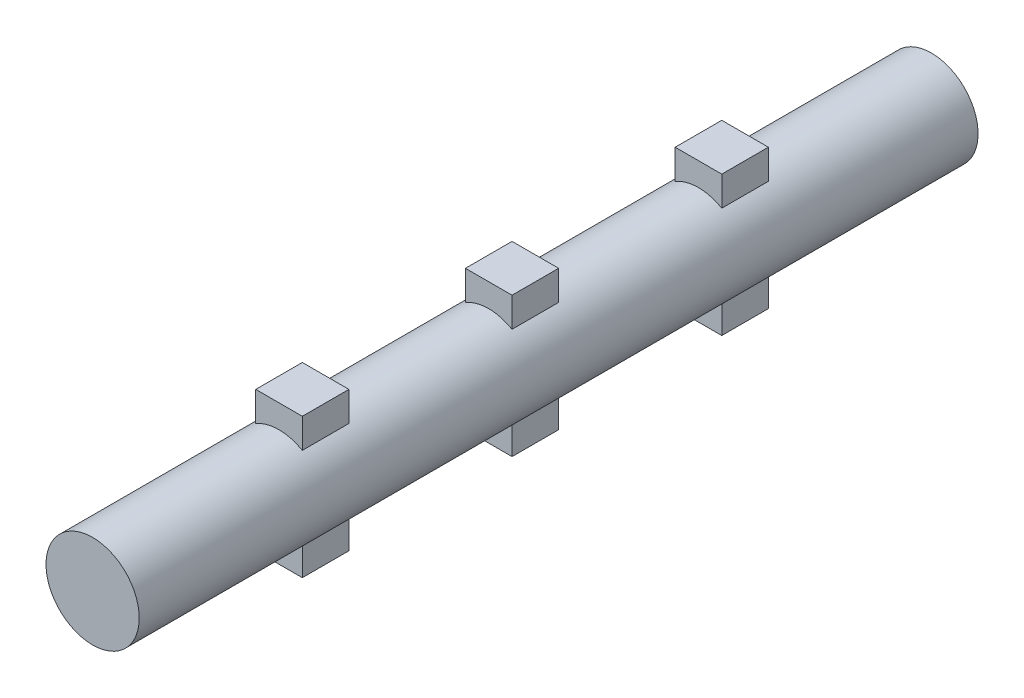
ISO-10303-21;
HEADER;
FILE_DESCRIPTION(('STEP AP214'),'2;1');
FILE_NAME('part.step','',(''),(''),'','','');
FILE_SCHEMA(('AUTOMOTIVE_DESIGN { 1 0 10303 214 1 1 1 1 }'));
ENDSEC;
DATA;
#1=APPLICATION_CONTEXT('core data for automotive mechanical design processes');
#2=APPLICATION_PROTOCOL_DEFINITION('international standard','automotive_design',2000,#1);
#3=PRODUCT_CONTEXT('',#1,'mechanical');
#4=PRODUCT('Part','Part','',(#3));
#5=PRODUCT_RELATED_PRODUCT_CATEGORY('part','',(#4));
#6=PRODUCT_DEFINITION_FORMATION('','',#4);
#7=PRODUCT_DEFINITION_CONTEXT('part definition',#1,'design');
#8=PRODUCT_DEFINITION('design','',#6,#7);
#9=PRODUCT_DEFINITION_SHAPE('','',#8);
#10=(LENGTH_UNIT() NAMED_UNIT(*) SI_UNIT(.MILLI.,.METRE.));
#11=(NAMED_UNIT(*) PLANE_ANGLE_UNIT() SI_UNIT($,.RADIAN.));
#12=(NAMED_UNIT(*) SI_UNIT($,.STERADIAN.) SOLID_ANGLE_UNIT());
#13=UNCERTAINTY_MEASURE_WITH_UNIT(LENGTH_MEASURE(1.E-05),#10,'distance_accuracy_value','');
#14=(GEOMETRIC_REPRESENTATION_CONTEXT(3) GLOBAL_UNCERTAINTY_ASSIGNED_CONTEXT((#13)) GLOBAL_UNIT_ASSIGNED_CONTEXT((#10,
#11,#12)) REPRESENTATION_CONTEXT('',''));
#15=CARTESIAN_POINT('',(0.,0.,0.));
#16=DIRECTION('',(0.,0.,1.));
#17=DIRECTION('',(1.,0.,0.));
#18=AXIS2_PLACEMENT_3D('',#15,#16,#17);
#19=CARTESIAN_POINT('',(0.,0.,25.));
#20=DIRECTION('',(0.,0.,1.));
#21=DIRECTION('',(1.,0.,0.));
#22=AXIS2_PLACEMENT_3D('',#19,#20,#21);
#23=PLANE('',#22);
#24=CARTESIAN_POINT('',(0.,0.,25.));
#25=DIRECTION('',(0.,0.,1.));
#26=DIRECTION('',(1.,0.,0.));
#27=AXIS2_PLACEMENT_3D('',#24,#25,#26);
#28=CIRCLE('',#27,5.);
#29=CARTESIAN_POINT('',(2.5,4.33012701892219,25.));
#30=VERTEX_POINT('',#29);
#31=CARTESIAN_POINT('',(-2.5,4.33012701892219,25.));
#32=VERTEX_POINT('',#31);
#33=EDGE_CURVE('E53',#30,#32,#28,.T.);
#34=ORIENTED_EDGE('',*,*,#33,.F.);
#35=DIRECTION('',(0.,1.,0.));
#36=VECTOR('',#35,1.);
#37=CARTESIAN_POINT('',(2.5,-7.5,25.));
#38=LINE('',#37,#36);
#39=CARTESIAN_POINT('',(2.5,7.5,25.));
#40=VERTEX_POINT('',#39);
#41=EDGE_CURVE('E222',#30,#40,#38,.T.);
#42=ORIENTED_EDGE('',*,*,#41,.T.);
#43=DIRECTION('',(-1.,0.,0.));
#44=VECTOR('',#43,1.);
#45=CARTESIAN_POINT('',(-2.5,7.5,25.));
#46=LINE('',#45,#44);
#47=CARTESIAN_POINT('',(-2.5,7.5,25.));
#48=VERTEX_POINT('',#47);
#49=EDGE_CURVE('E397',#40,#48,#46,.T.);
#50=ORIENTED_EDGE('',*,*,#49,.T.);
#51=DIRECTION('',(0.,-1.,0.));
#52=VECTOR('',#51,1.);
#53=CARTESIAN_POINT('',(-2.5,-7.5,25.));
#54=LINE('',#53,#52);
#55=EDGE_CURVE('E234',#48,#32,#54,.T.);
#56=ORIENTED_EDGE('',*,*,#55,.T.);
#57=EDGE_LOOP('',(#34,#42,#50,#56));
#58=FACE_BOUND('',#57,.T.);
#59=ADVANCED_FACE('F40',(#58),#23,.T.);
#60=CARTESIAN_POINT('',(0.,0.,-25.));
#61=DIRECTION('',(0.,0.,-1.));
#62=DIRECTION('',(-1.,0.,0.));
#63=AXIS2_PLACEMENT_3D('',#60,#61,#62);
#64=PLANE('',#63);
#65=CARTESIAN_POINT('',(0.,0.,-25.));
#66=DIRECTION('',(0.,0.,-1.));
#67=DIRECTION('',(-1.,0.,0.));
#68=AXIS2_PLACEMENT_3D('',#65,#66,#67);
#69=CIRCLE('',#68,5.);
#70=CARTESIAN_POINT('',(-2.5,4.33012701892219,-25.));
#71=VERTEX_POINT('',#70);
#72=CARTESIAN_POINT('',(2.5,4.33012701892219,-25.));
#73=VERTEX_POINT('',#72);
#74=EDGE_CURVE('E248',#71,#73,#69,.T.);
#75=ORIENTED_EDGE('',*,*,#74,.F.);
#76=DIRECTION('',(0.,1.,0.));
#77=VECTOR('',#76,1.);
#78=CARTESIAN_POINT('',(-2.5,-7.5,-25.));
#79=LINE('',#78,#77);
#80=CARTESIAN_POINT('',(-2.5,7.5,-25.));
#81=VERTEX_POINT('',#80);
#82=EDGE_CURVE('E283',#71,#81,#79,.T.);
#83=ORIENTED_EDGE('',*,*,#82,.T.);
#84=DIRECTION('',(1.,0.,0.));
#85=VECTOR('',#84,1.);
#86=CARTESIAN_POINT('',(-2.5,7.5,-25.));
#87=LINE('',#86,#85);
#88=CARTESIAN_POINT('',(2.5,7.5,-25.));
#89=VERTEX_POINT('',#88);
#90=EDGE_CURVE('E286',#81,#89,#87,.T.);
#91=ORIENTED_EDGE('',*,*,#90,.T.);
#92=DIRECTION('',(0.,-1.,0.));
#93=VECTOR('',#92,1.);
#94=CARTESIAN_POINT('',(2.5,-7.5,-25.));
#95=LINE('',#94,#93);
#96=EDGE_CURVE('E68',#89,#73,#95,.T.);
#97=ORIENTED_EDGE('',*,*,#96,.T.);
#98=EDGE_LOOP('',(#75,#83,#91,#97));
#99=FACE_BOUND('',#98,.T.);
#100=ADVANCED_FACE('F505',(#99),#64,.T.);
#101=CARTESIAN_POINT('',(2.5,-7.5,2.5));
#102=DIRECTION('',(1.,0.,0.));
#103=DIRECTION('',(0.,0.,-1.));
#104=AXIS2_PLACEMENT_3D('',#101,#102,#103);
#105=PLANE('',#104);
#106=DIRECTION('',(0.,0.,-1.));
#107=VECTOR('',#106,1.);
#108=CARTESIAN_POINT('',(2.5,4.33012701892219,25.));
#109=LINE('',#108,#107);
#110=CARTESIAN_POINT('',(2.5,4.33012701892219,-2.5));
#111=VERTEX_POINT('',#110);
#112=CARTESIAN_POINT('',(2.5,4.33012701892219,2.5));
#113=VERTEX_POINT('',#112);
#114=EDGE_CURVE('E357',#111,#113,#109,.F.);
#115=ORIENTED_EDGE('',*,*,#114,.F.);
#116=DIRECTION('',(0.,-1.,0.));
#117=VECTOR('',#116,1.);
#118=CARTESIAN_POINT('',(2.5,-7.5,-2.5));
#119=LINE('',#118,#117);
#120=CARTESIAN_POINT('',(2.5,7.5,-2.5));
#121=VERTEX_POINT('',#120);
#122=EDGE_CURVE('E327',#121,#111,#119,.T.);
#123=ORIENTED_EDGE('',*,*,#122,.F.);
#124=DIRECTION('',(0.,0.,-1.));
#125=VECTOR('',#124,1.);
#126=CARTESIAN_POINT('',(2.5,7.5,2.5));
#127=LINE('',#126,#125);
#128=CARTESIAN_POINT('',(2.5,7.5,2.5));
#129=VERTEX_POINT('',#128);
#130=EDGE_CURVE('E362',#129,#121,#127,.T.);
#131=ORIENTED_EDGE('',*,*,#130,.F.);
#132=DIRECTION('',(0.,-1.,0.));
#133=VECTOR('',#132,1.);
#134=CARTESIAN_POINT('',(2.5,-7.5,2.5));
#135=LINE('',#134,#133);
#136=EDGE_CURVE('E345',#129,#113,#135,.T.);
#137=ORIENTED_EDGE('',*,*,#136,.T.);
#138=EDGE_LOOP('',(#115,#123,#131,#137));
#139=FACE_BOUND('',#138,.T.);
#140=ADVANCED_FACE('F510',(#139),#105,.T.);
#141=CARTESIAN_POINT('',(2.5,-4.33012701892219,-2.5));
#142=VERTEX_POINT('',#141);
#143=CARTESIAN_POINT('',(2.5,-7.5,-2.5));
#144=VERTEX_POINT('',#143);
#145=EDGE_CURVE('E326',#142,#144,#119,.T.);
#146=ORIENTED_EDGE('',*,*,#145,.F.);
#147=DIRECTION('',(0.,0.,-1.));
#148=VECTOR('',#147,1.);
#149=CARTESIAN_POINT('',(2.5,-4.33012701892219,25.));
#150=LINE('',#149,#148);
#151=CARTESIAN_POINT('',(2.5,-4.33012701892219,2.5));
#152=VERTEX_POINT('',#151);
#153=EDGE_CURVE('E370',#152,#142,#150,.T.);
#154=ORIENTED_EDGE('',*,*,#153,.F.);
#155=CARTESIAN_POINT('',(2.5,-7.5,2.5));
#156=VERTEX_POINT('',#155);
#157=EDGE_CURVE('E344',#152,#156,#135,.T.);
#158=ORIENTED_EDGE('',*,*,#157,.T.);
#159=DIRECTION('',(0.,0.,-1.));
#160=VECTOR('',#159,1.);
#161=CARTESIAN_POINT('',(2.5,-7.5,2.5));
#162=LINE('',#161,#160);
#163=EDGE_CURVE('E358',#156,#144,#162,.T.);
#164=ORIENTED_EDGE('',*,*,#163,.T.);
#165=EDGE_LOOP('',(#146,#154,#158,#164));
#166=FACE_BOUND('',#165,.T.);
#167=ADVANCED_FACE('F566',(#166),#105,.T.);
#168=CARTESIAN_POINT('',(-2.5,-7.5,2.5));
#169=DIRECTION('',(-1.,0.,0.));
#170=DIRECTION('',(0.,0.,1.));
#171=AXIS2_PLACEMENT_3D('',#168,#169,#170);
#172=PLANE('',#171);
#173=DIRECTION('',(0.,0.,-1.));
#174=VECTOR('',#173,1.);
#175=CARTESIAN_POINT('',(-2.5,-4.33012701892219,25.));
#176=LINE('',#175,#174);
#177=CARTESIAN_POINT('',(-2.5,-4.33012701892219,-2.5));
#178=VERTEX_POINT('',#177);
#179=CARTESIAN_POINT('',(-2.5,-4.33012701892219,2.5));
#180=VERTEX_POINT('',#179);
#181=EDGE_CURVE('E373',#178,#180,#176,.F.);
#182=ORIENTED_EDGE('',*,*,#181,.F.);
#183=DIRECTION('',(0.,1.,0.));
#184=VECTOR('',#183,1.);
#185=CARTESIAN_POINT('',(-2.5,-7.5,-2.5));
#186=LINE('',#185,#184);
#187=CARTESIAN_POINT('',(-2.5,-7.5,-2.5));
#188=VERTEX_POINT('',#187);
#189=EDGE_CURVE('E318',#188,#178,#186,.T.);
#190=ORIENTED_EDGE('',*,*,#189,.F.);
#191=DIRECTION('',(0.,0.,-1.));
#192=VECTOR('',#191,1.);
#193=CARTESIAN_POINT('',(-2.5,-7.5,2.5));
#194=LINE('',#193,#192);
#195=CARTESIAN_POINT('',(-2.5,-7.5,2.5));
#196=VERTEX_POINT('',#195);
#197=EDGE_CURVE('E354',#196,#188,#194,.T.);
#198=ORIENTED_EDGE('',*,*,#197,.F.);
#199=DIRECTION('',(0.,1.,0.));
#200=VECTOR('',#199,1.);
#201=CARTESIAN_POINT('',(-2.5,-7.5,2.5));
#202=LINE('',#201,#200);
#203=EDGE_CURVE('E336',#196,#180,#202,.T.);
#204=ORIENTED_EDGE('',*,*,#203,.T.);
#205=EDGE_LOOP('',(#182,#190,#198,#204));
#206=FACE_BOUND('',#205,.T.);
#207=ADVANCED_FACE('F563',(#206),#172,.T.);
#208=CARTESIAN_POINT('',(-2.5,4.33012701892219,-2.5));
#209=VERTEX_POINT('',#208);
#210=CARTESIAN_POINT('',(-2.5,7.5,-2.5));
#211=VERTEX_POINT('',#210);
#212=EDGE_CURVE('E317',#209,#211,#186,.T.);
#213=ORIENTED_EDGE('',*,*,#212,.F.);
#214=DIRECTION('',(0.,0.,-1.));
#215=VECTOR('',#214,1.);
#216=CARTESIAN_POINT('',(-2.5,4.33012701892219,25.));
#217=LINE('',#216,#215);
#218=CARTESIAN_POINT('',(-2.5,4.33012701892219,2.5));
#219=VERTEX_POINT('',#218);
#220=EDGE_CURVE('E231',#219,#209,#217,.T.);
#221=ORIENTED_EDGE('',*,*,#220,.F.);
#222=CARTESIAN_POINT('',(-2.5,7.5,2.5));
#223=VERTEX_POINT('',#222);
#224=EDGE_CURVE('E335',#219,#223,#202,.T.);
#225=ORIENTED_EDGE('',*,*,#224,.T.);
#226=DIRECTION('',(0.,0.,-1.));
#227=VECTOR('',#226,1.);
#228=CARTESIAN_POINT('',(-2.5,7.5,2.5));
#229=LINE('',#228,#227);
#230=EDGE_CURVE('E353',#223,#211,#229,.T.);
#231=ORIENTED_EDGE('',*,*,#230,.T.);
#232=EDGE_LOOP('',(#213,#221,#225,#231));
#233=FACE_BOUND('',#232,.T.);
#234=ADVANCED_FACE('F452',(#233),#172,.T.);
#235=CARTESIAN_POINT('',(0.,0.,-2.5));
#236=DIRECTION('',(0.,0.,1.));
#237=DIRECTION('',(1.,0.,0.));
#238=AXIS2_PLACEMENT_3D('',#235,#236,#237);
#239=PLANE('',#238);
#240=CARTESIAN_POINT('',(0.,0.,-2.5));
#241=DIRECTION('',(0.,0.,1.));
#242=DIRECTION('',(1.,0.,0.));
#243=AXIS2_PLACEMENT_3D('',#240,#241,#242);
#244=CIRCLE('',#243,5.);
#245=EDGE_CURVE('E438',#142,#178,#244,.F.);
#246=ORIENTED_EDGE('',*,*,#245,.F.);
#247=ORIENTED_EDGE('',*,*,#145,.T.);
#248=DIRECTION('',(-1.,0.,0.));
#249=VECTOR('',#248,1.);
#250=CARTESIAN_POINT('',(2.5,-7.5,-2.5));
#251=LINE('',#250,#249);
#252=EDGE_CURVE('E331',#144,#188,#251,.T.);
#253=ORIENTED_EDGE('',*,*,#252,.T.);
#254=ORIENTED_EDGE('',*,*,#189,.T.);
#255=EDGE_LOOP('',(#246,#247,#253,#254));
#256=FACE_BOUND('',#255,.T.);
#257=ADVANCED_FACE('F523',(#256),#239,.F.);
#258=CARTESIAN_POINT('',(0.,0.,25.));
#259=DIRECTION('',(0.,0.,-1.));
#260=DIRECTION('',(-1.,0.,0.));
#261=AXIS2_PLACEMENT_3D('',#258,#259,#260);
#262=CYLINDRICAL_SURFACE('',#261,5.);
#263=DIRECTION('',(0.,0.,-1.));
#264=VECTOR('',#263,1.);
#265=CARTESIAN_POINT('',(-2.5,-4.33012701892219,25.));
#266=LINE('',#265,#264);
#267=CARTESIAN_POINT('',(-2.5,-4.33012701892219,20.));
#268=VERTEX_POINT('',#267);
#269=CARTESIAN_POINT('',(-2.5,-4.33012701892219,25.));
#270=VERTEX_POINT('',#269);
#271=EDGE_CURVE('E410',#268,#270,#266,.F.);
#272=ORIENTED_EDGE('',*,*,#271,.T.);
#273=CARTESIAN_POINT('',(2.5,-4.33012701892219,25.));
#274=VERTEX_POINT('',#273);
#275=EDGE_CURVE('E11',#270,#274,#28,.T.);
#276=ORIENTED_EDGE('',*,*,#275,.T.);
#277=DIRECTION('',(0.,0.,-1.));
#278=VECTOR('',#277,1.);
#279=CARTESIAN_POINT('',(2.5,-4.33012701892219,25.));
#280=LINE('',#279,#278);
#281=CARTESIAN_POINT('',(2.5,-4.33012701892219,20.));
#282=VERTEX_POINT('',#281);
#283=EDGE_CURVE('E218',#274,#282,#280,.T.);
#284=ORIENTED_EDGE('',*,*,#283,.T.);
#285=CARTESIAN_POINT('',(0.,0.,20.));
#286=DIRECTION('',(0.,0.,-1.));
#287=DIRECTION('',(-1.,0.,0.));
#288=AXIS2_PLACEMENT_3D('',#285,#286,#287);
#289=CIRCLE('',#288,5.);
#290=EDGE_CURVE('E428',#282,#268,#289,.T.);
#291=ORIENTED_EDGE('',*,*,#290,.T.);
#292=EDGE_LOOP('',(#272,#276,#284,#291));
#293=FACE_BOUND('',#292,.T.);
#294=DIRECTION('',(0.,0.,-1.));
#295=VECTOR('',#294,1.);
#296=CARTESIAN_POINT('',(2.5,-4.33012701892219,25.));
#297=LINE('',#296,#295);
#298=CARTESIAN_POINT('',(2.5,-4.33012701892219,-20.));
#299=VERTEX_POINT('',#298);
#300=CARTESIAN_POINT('',(2.5,-4.33012701892219,-25.));
#301=VERTEX_POINT('',#300);
#302=EDGE_CURVE('E313',#299,#301,#297,.T.);
#303=ORIENTED_EDGE('',*,*,#302,.T.);
#304=CARTESIAN_POINT('',(-2.5,-4.33012701892219,-25.));
#305=VERTEX_POINT('',#304);
#306=EDGE_CURVE('E51',#301,#305,#69,.T.);
#307=ORIENTED_EDGE('',*,*,#306,.T.);
#308=DIRECTION('',(0.,0.,-1.));
#309=VECTOR('',#308,1.);
#310=CARTESIAN_POINT('',(-2.5,-4.33012701892219,25.));
#311=LINE('',#310,#309);
#312=CARTESIAN_POINT('',(-2.5,-4.33012701892219,-20.));
#313=VERTEX_POINT('',#312);
#314=EDGE_CURVE('E292',#305,#313,#311,.F.);
#315=ORIENTED_EDGE('',*,*,#314,.T.);
#316=CARTESIAN_POINT('',(0.,0.,-20.));
#317=DIRECTION('',(0.,0.,-1.));
#318=DIRECTION('',(-1.,0.,0.));
#319=AXIS2_PLACEMENT_3D('',#316,#317,#318);
#320=CIRCLE('',#319,5.);
#321=EDGE_CURVE('E44',#299,#313,#320,.T.);
#322=ORIENTED_EDGE('',*,*,#321,.F.);
#323=EDGE_LOOP('',(#303,#307,#315,#322));
#324=FACE_BOUND('',#323,.T.);
#325=ORIENTED_EDGE('',*,*,#74,.T.);
#326=DIRECTION('',(0.,0.,-1.));
#327=VECTOR('',#326,1.);
#328=CARTESIAN_POINT('',(2.5,4.33012701892219,25.));
#329=LINE('',#328,#327);
#330=CARTESIAN_POINT('',(2.5,4.33012701892219,-20.));
#331=VERTEX_POINT('',#330);
#332=EDGE_CURVE('E309',#73,#331,#329,.F.);
#333=ORIENTED_EDGE('',*,*,#332,.T.);
#334=CARTESIAN_POINT('',(-2.5,4.33012701892219,-20.));
#335=VERTEX_POINT('',#334);
#336=EDGE_CURVE('E481',#335,#331,#320,.T.);
#337=ORIENTED_EDGE('',*,*,#336,.F.);
#338=DIRECTION('',(0.,0.,-1.));
#339=VECTOR('',#338,1.);
#340=CARTESIAN_POINT('',(-2.5,4.33012701892219,25.));
#341=LINE('',#340,#339);
#342=EDGE_CURVE('E306',#335,#71,#341,.T.);
#343=ORIENTED_EDGE('',*,*,#342,.T.);
#344=EDGE_LOOP('',(#325,#333,#337,#343));
#345=FACE_BOUND('',#344,.T.);
#346=EDGE_CURVE('E435',#209,#111,#244,.F.);
#347=ORIENTED_EDGE('',*,*,#346,.T.);
#348=ORIENTED_EDGE('',*,*,#114,.T.);
#349=CARTESIAN_POINT('',(0.,0.,2.5));
#350=DIRECTION('',(0.,0.,1.));
#351=DIRECTION('',(1.,0.,0.));
#352=AXIS2_PLACEMENT_3D('',#349,#350,#351);
#353=CIRCLE('',#352,5.);
#354=EDGE_CURVE('E434',#113,#219,#353,.T.);
#355=ORIENTED_EDGE('',*,*,#354,.T.);
#356=ORIENTED_EDGE('',*,*,#220,.T.);
#357=EDGE_LOOP('',(#347,#348,#355,#356));
#358=FACE_BOUND('',#357,.T.);
#359=ORIENTED_EDGE('',*,*,#153,.T.);
#360=ORIENTED_EDGE('',*,*,#245,.T.);
#361=ORIENTED_EDGE('',*,*,#181,.T.);
#362=EDGE_CURVE('E432',#180,#152,#353,.T.);
#363=ORIENTED_EDGE('',*,*,#362,.T.);
#364=EDGE_LOOP('',(#359,#360,#361,#363));
#365=FACE_BOUND('',#364,.T.);
#366=CARTESIAN_POINT('',(-2.5,4.33012701892219,20.));
#367=VERTEX_POINT('',#366);
#368=CARTESIAN_POINT('',(2.5,4.33012701892219,20.));
#369=VERTEX_POINT('',#368);
#370=EDGE_CURVE('E214',#367,#369,#289,.T.);
#371=ORIENTED_EDGE('',*,*,#370,.T.);
#372=DIRECTION('',(0.,0.,-1.));
#373=VECTOR('',#372,1.);
#374=CARTESIAN_POINT('',(2.5,4.33012701892219,25.));
#375=LINE('',#374,#373);
#376=EDGE_CURVE('E209',#369,#30,#375,.F.);
#377=ORIENTED_EDGE('',*,*,#376,.T.);
#378=ORIENTED_EDGE('',*,*,#33,.T.);
#379=DIRECTION('',(0.,0.,-1.));
#380=VECTOR('',#379,1.);
#381=CARTESIAN_POINT('',(-2.5,4.33012701892219,25.));
#382=LINE('',#381,#380);
#383=EDGE_CURVE('E219',#32,#367,#382,.T.);
#384=ORIENTED_EDGE('',*,*,#383,.T.);
#385=EDGE_LOOP('',(#371,#377,#378,#384));
#386=FACE_BOUND('',#385,.T.);
#387=CARTESIAN_POINT('',(0.,0.,-45.));
#388=DIRECTION('',(0.,0.,-1.));
#389=DIRECTION('',(-1.,0.,0.));
#390=AXIS2_PLACEMENT_3D('',#387,#388,#389);
#391=CIRCLE('',#390,5.);
#392=CARTESIAN_POINT('',(-5.,0.,-45.));
#393=VERTEX_POINT('',#392);
#394=EDGE_CURVE('E243',#393,#393,#391,.T.);
#395=ORIENTED_EDGE('',*,*,#394,.F.);
#396=EDGE_LOOP('',(#395));
#397=FACE_BOUND('',#396,.T.);
#398=CARTESIAN_POINT('',(0.,0.,45.));
#399=DIRECTION('',(0.,0.,1.));
#400=DIRECTION('',(1.,0.,0.));
#401=AXIS2_PLACEMENT_3D('',#398,#399,#400);
#402=CIRCLE('',#401,5.);
#403=CARTESIAN_POINT('',(5.,0.,45.));
#404=VERTEX_POINT('',#403);
#405=EDGE_CURVE('E237',#404,#404,#402,.T.);
#406=ORIENTED_EDGE('',*,*,#405,.F.);
#407=EDGE_LOOP('',(#406));
#408=FACE_BOUND('',#407,.T.);
#409=ADVANCED_FACE('F42',(#293,#324,#345,#358,#365,#386,#397,#408),#262,.T.);
#410=ORIENTED_EDGE('',*,*,#275,.F.);
#411=CARTESIAN_POINT('',(-2.5,-7.5,25.));
#412=VERTEX_POINT('',#411);
#413=EDGE_CURVE('E400',#270,#412,#54,.T.);
#414=ORIENTED_EDGE('',*,*,#413,.T.);
#415=DIRECTION('',(1.,0.,0.));
#416=VECTOR('',#415,1.);
#417=CARTESIAN_POINT('',(-2.5,-7.5,25.));
#418=LINE('',#417,#416);
#419=CARTESIAN_POINT('',(2.5,-7.5,25.));
#420=VERTEX_POINT('',#419);
#421=EDGE_CURVE('E403',#412,#420,#418,.T.);
#422=ORIENTED_EDGE('',*,*,#421,.T.);
#423=EDGE_CURVE('E230',#420,#274,#38,.T.);
#424=ORIENTED_EDGE('',*,*,#423,.T.);
#425=EDGE_LOOP('',(#410,#414,#422,#424));
#426=FACE_BOUND('',#425,.T.);
#427=ADVANCED_FACE('F506',(#426),#23,.T.);
#428=CARTESIAN_POINT('',(-2.5,-7.5,20.));
#429=DIRECTION('',(0.,-1.,0.));
#430=DIRECTION('',(0.,0.,-1.));
#431=AXIS2_PLACEMENT_3D('',#428,#429,#430);
#432=PLANE('',#431);
#433=ORIENTED_EDGE('',*,*,#421,.F.);
#434=DIRECTION('',(0.,0.,1.));
#435=VECTOR('',#434,1.);
#436=CARTESIAN_POINT('',(-2.5,-7.5,20.));
#437=LINE('',#436,#435);
#438=CARTESIAN_POINT('',(-2.5,-7.5,20.));
#439=VERTEX_POINT('',#438);
#440=EDGE_CURVE('E411',#439,#412,#437,.T.);
#441=ORIENTED_EDGE('',*,*,#440,.F.);
#442=DIRECTION('',(1.,0.,0.));
#443=VECTOR('',#442,1.);
#444=CARTESIAN_POINT('',(-2.5,-7.5,20.));
#445=LINE('',#444,#443);
#446=CARTESIAN_POINT('',(2.5,-7.5,20.));
#447=VERTEX_POINT('',#446);
#448=EDGE_CURVE('E392',#439,#447,#445,.T.);
#449=ORIENTED_EDGE('',*,*,#448,.T.);
#450=DIRECTION('',(0.,0.,1.));
#451=VECTOR('',#450,1.);
#452=CARTESIAN_POINT('',(2.5,-7.5,20.));
#453=LINE('',#452,#451);
#454=EDGE_CURVE('E407',#447,#420,#453,.T.);
#455=ORIENTED_EDGE('',*,*,#454,.T.);
#456=EDGE_LOOP('',(#433,#441,#449,#455));
#457=FACE_BOUND('',#456,.T.);
#458=ADVANCED_FACE('F514',(#457),#432,.T.);
#459=CARTESIAN_POINT('',(0.,0.,20.));
#460=DIRECTION('',(0.,0.,-1.));
#461=DIRECTION('',(-1.,0.,0.));
#462=AXIS2_PLACEMENT_3D('',#459,#460,#461);
#463=PLANE('',#462);
#464=ORIENTED_EDGE('',*,*,#290,.F.);
#465=DIRECTION('',(0.,1.,0.));
#466=VECTOR('',#465,1.);
#467=CARTESIAN_POINT('',(2.5,-7.5,20.));
#468=LINE('',#467,#466);
#469=EDGE_CURVE('E378',#447,#282,#468,.T.);
#470=ORIENTED_EDGE('',*,*,#469,.F.);
#471=ORIENTED_EDGE('',*,*,#448,.F.);
#472=DIRECTION('',(0.,-1.,0.));
#473=VECTOR('',#472,1.);
#474=CARTESIAN_POINT('',(-2.5,-7.5,20.));
#475=LINE('',#474,#473);
#476=EDGE_CURVE('E387',#268,#439,#475,.T.);
#477=ORIENTED_EDGE('',*,*,#476,.F.);
#478=EDGE_LOOP('',(#464,#470,#471,#477));
#479=FACE_BOUND('',#478,.T.);
#480=ADVANCED_FACE('F520',(#479),#463,.T.);
#481=CARTESIAN_POINT('',(-2.5,-7.5,20.));
#482=DIRECTION('',(-1.,0.,0.));
#483=DIRECTION('',(0.,0.,1.));
#484=AXIS2_PLACEMENT_3D('',#481,#482,#483);
#485=PLANE('',#484);
#486=ORIENTED_EDGE('',*,*,#271,.F.);
#487=ORIENTED_EDGE('',*,*,#476,.T.);
#488=ORIENTED_EDGE('',*,*,#440,.T.);
#489=ORIENTED_EDGE('',*,*,#413,.F.);
#490=EDGE_LOOP('',(#486,#487,#488,#489));
#491=FACE_BOUND('',#490,.T.);
#492=ADVANCED_FACE('F529',(#491),#485,.T.);
#493=CARTESIAN_POINT('',(2.5,-7.5,20.));
#494=DIRECTION('',(1.,0.,0.));
#495=DIRECTION('',(0.,0.,-1.));
#496=AXIS2_PLACEMENT_3D('',#493,#494,#495);
#497=PLANE('',#496);
#498=ORIENTED_EDGE('',*,*,#283,.F.);
#499=ORIENTED_EDGE('',*,*,#423,.F.);
#500=ORIENTED_EDGE('',*,*,#454,.F.);
#501=ORIENTED_EDGE('',*,*,#469,.T.);
#502=EDGE_LOOP('',(#498,#499,#500,#501));
#503=FACE_BOUND('',#502,.T.);
#504=ADVANCED_FACE('F538',(#503),#497,.T.);
#505=ORIENTED_EDGE('',*,*,#370,.F.);
#506=CARTESIAN_POINT('',(-2.5,7.5,20.));
#507=VERTEX_POINT('',#506);
#508=EDGE_CURVE('E388',#507,#367,#475,.T.);
#509=ORIENTED_EDGE('',*,*,#508,.F.);
#510=DIRECTION('',(-1.,0.,0.));
#511=VECTOR('',#510,1.);
#512=CARTESIAN_POINT('',(-2.5,7.5,20.));
#513=LINE('',#512,#511);
#514=CARTESIAN_POINT('',(2.5,7.5,20.));
#515=VERTEX_POINT('',#514);
#516=EDGE_CURVE('E382',#515,#507,#513,.T.);
#517=ORIENTED_EDGE('',*,*,#516,.F.);
#518=EDGE_CURVE('E383',#369,#515,#468,.T.);
#519=ORIENTED_EDGE('',*,*,#518,.F.);
#520=EDGE_LOOP('',(#505,#509,#517,#519));
#521=FACE_BOUND('',#520,.T.);
#522=ADVANCED_FACE('F540',(#521),#463,.T.);
#523=ORIENTED_EDGE('',*,*,#376,.F.);
#524=ORIENTED_EDGE('',*,*,#518,.T.);
#525=DIRECTION('',(0.,0.,1.));
#526=VECTOR('',#525,1.);
#527=CARTESIAN_POINT('',(2.5,7.5,20.));
#528=LINE('',#527,#526);
#529=EDGE_CURVE('E225',#515,#40,#528,.T.);
#530=ORIENTED_EDGE('',*,*,#529,.T.);
#531=ORIENTED_EDGE('',*,*,#41,.F.);
#532=EDGE_LOOP('',(#523,#524,#530,#531));
#533=FACE_BOUND('',#532,.T.);
#534=ADVANCED_FACE('F223',(#533),#497,.T.);
#535=ORIENTED_EDGE('',*,*,#383,.F.);
#536=ORIENTED_EDGE('',*,*,#55,.F.);
#537=DIRECTION('',(0.,0.,1.));
#538=VECTOR('',#537,1.);
#539=CARTESIAN_POINT('',(-2.5,7.5,20.));
#540=LINE('',#539,#538);
#541=EDGE_CURVE('E415',#507,#48,#540,.T.);
#542=ORIENTED_EDGE('',*,*,#541,.F.);
#543=ORIENTED_EDGE('',*,*,#508,.T.);
#544=EDGE_LOOP('',(#535,#536,#542,#543));
#545=FACE_BOUND('',#544,.T.);
#546=ADVANCED_FACE('F548',(#545),#485,.T.);
#547=CARTESIAN_POINT('',(-2.5,7.5,20.));
#548=DIRECTION('',(0.,1.,0.));
#549=DIRECTION('',(0.,0.,1.));
#550=AXIS2_PLACEMENT_3D('',#547,#548,#549);
#551=PLANE('',#550);
#552=ORIENTED_EDGE('',*,*,#49,.F.);
#553=ORIENTED_EDGE('',*,*,#529,.F.);
#554=ORIENTED_EDGE('',*,*,#516,.T.);
#555=ORIENTED_EDGE('',*,*,#541,.T.);
#556=EDGE_LOOP('',(#552,#553,#554,#555));
#557=FACE_BOUND('',#556,.T.);
#558=ADVANCED_FACE('F554',(#557),#551,.T.);
#559=CARTESIAN_POINT('',(2.5,-7.5,2.5));
#560=DIRECTION('',(0.,-1.,0.));
#561=DIRECTION('',(0.,0.,-1.));
#562=AXIS2_PLACEMENT_3D('',#559,#560,#561);
#563=PLANE('',#562);
#564=ORIENTED_EDGE('',*,*,#197,.T.);
#565=ORIENTED_EDGE('',*,*,#252,.F.);
#566=ORIENTED_EDGE('',*,*,#163,.F.);
#567=DIRECTION('',(-1.,0.,0.));
#568=VECTOR('',#567,1.);
#569=CARTESIAN_POINT('',(2.5,-7.5,2.5));
#570=LINE('',#569,#568);
#571=EDGE_CURVE('E349',#156,#196,#570,.T.);
#572=ORIENTED_EDGE('',*,*,#571,.T.);
#573=EDGE_LOOP('',(#564,#565,#566,#572));
#574=FACE_BOUND('',#573,.T.);
#575=ADVANCED_FACE('F559',(#574),#563,.T.);
#576=CARTESIAN_POINT('',(0.,0.,2.5));
#577=DIRECTION('',(0.,0.,1.));
#578=DIRECTION('',(1.,0.,0.));
#579=AXIS2_PLACEMENT_3D('',#576,#577,#578);
#580=PLANE('',#579);
#581=ORIENTED_EDGE('',*,*,#362,.F.);
#582=ORIENTED_EDGE('',*,*,#203,.F.);
#583=ORIENTED_EDGE('',*,*,#571,.F.);
#584=ORIENTED_EDGE('',*,*,#157,.F.);
#585=EDGE_LOOP('',(#581,#582,#583,#584));
#586=FACE_BOUND('',#585,.T.);
#587=ADVANCED_FACE('F578',(#586),#580,.T.);
#588=ORIENTED_EDGE('',*,*,#354,.F.);
#589=ORIENTED_EDGE('',*,*,#136,.F.);
#590=DIRECTION('',(1.,0.,0.));
#591=VECTOR('',#590,1.);
#592=CARTESIAN_POINT('',(2.5,7.5,2.5));
#593=LINE('',#592,#591);
#594=EDGE_CURVE('E340',#223,#129,#593,.T.);
#595=ORIENTED_EDGE('',*,*,#594,.F.);
#596=ORIENTED_EDGE('',*,*,#224,.F.);
#597=EDGE_LOOP('',(#588,#589,#595,#596));
#598=FACE_BOUND('',#597,.T.);
#599=ADVANCED_FACE('F455',(#598),#580,.T.);
#600=CARTESIAN_POINT('',(2.5,7.5,2.5));
#601=DIRECTION('',(0.,1.,0.));
#602=DIRECTION('',(0.,0.,1.));
#603=AXIS2_PLACEMENT_3D('',#600,#601,#602);
#604=PLANE('',#603);
#605=ORIENTED_EDGE('',*,*,#130,.T.);
#606=DIRECTION('',(1.,0.,0.));
#607=VECTOR('',#606,1.);
#608=CARTESIAN_POINT('',(2.5,7.5,-2.5));
#609=LINE('',#608,#607);
#610=EDGE_CURVE('E322',#211,#121,#609,.T.);
#611=ORIENTED_EDGE('',*,*,#610,.F.);
#612=ORIENTED_EDGE('',*,*,#230,.F.);
#613=ORIENTED_EDGE('',*,*,#594,.T.);
#614=EDGE_LOOP('',(#605,#611,#612,#613));
#615=FACE_BOUND('',#614,.T.);
#616=ADVANCED_FACE('F568',(#615),#604,.T.);
#617=ORIENTED_EDGE('',*,*,#346,.F.);
#618=ORIENTED_EDGE('',*,*,#212,.T.);
#619=ORIENTED_EDGE('',*,*,#610,.T.);
#620=ORIENTED_EDGE('',*,*,#122,.T.);
#621=EDGE_LOOP('',(#617,#618,#619,#620));
#622=FACE_BOUND('',#621,.T.);
#623=ADVANCED_FACE('F571',(#622),#239,.F.);
#624=ORIENTED_EDGE('',*,*,#306,.F.);
#625=CARTESIAN_POINT('',(2.5,-7.5,-25.));
#626=VERTEX_POINT('',#625);
#627=EDGE_CURVE('E258',#301,#626,#95,.T.);
#628=ORIENTED_EDGE('',*,*,#627,.T.);
#629=DIRECTION('',(-1.,0.,0.));
#630=VECTOR('',#629,1.);
#631=CARTESIAN_POINT('',(-2.5,-7.5,-25.));
#632=LINE('',#631,#630);
#633=CARTESIAN_POINT('',(-2.5,-7.5,-25.));
#634=VERTEX_POINT('',#633);
#635=EDGE_CURVE('E280',#626,#634,#632,.T.);
#636=ORIENTED_EDGE('',*,*,#635,.T.);
#637=EDGE_CURVE('E60',#634,#305,#79,.T.);
#638=ORIENTED_EDGE('',*,*,#637,.T.);
#639=EDGE_LOOP('',(#624,#628,#636,#638));
#640=FACE_BOUND('',#639,.T.);
#641=ADVANCED_FACE('F464',(#640),#64,.T.);
#642=CARTESIAN_POINT('',(-2.5,-7.5,-20.));
#643=DIRECTION('',(0.,-1.,0.));
#644=DIRECTION('',(1.,0.,0.));
#645=AXIS2_PLACEMENT_3D('',#642,#643,#644);
#646=PLANE('',#645);
#647=ORIENTED_EDGE('',*,*,#635,.F.);
#648=DIRECTION('',(0.,0.,-1.));
#649=VECTOR('',#648,1.);
#650=CARTESIAN_POINT('',(2.5,-7.5,-20.));
#651=LINE('',#650,#649);
#652=CARTESIAN_POINT('',(2.5,-7.5,-20.));
#653=VERTEX_POINT('',#652);
#654=EDGE_CURVE('E277',#653,#626,#651,.T.);
#655=ORIENTED_EDGE('',*,*,#654,.F.);
#656=DIRECTION('',(-1.,0.,0.));
#657=VECTOR('',#656,1.);
#658=CARTESIAN_POINT('',(-2.5,-7.5,-20.));
#659=LINE('',#658,#657);
#660=CARTESIAN_POINT('',(-2.5,-7.5,-20.));
#661=VERTEX_POINT('',#660);
#662=EDGE_CURVE('E263',#653,#661,#659,.T.);
#663=ORIENTED_EDGE('',*,*,#662,.T.);
#664=DIRECTION('',(0.,0.,-1.));
#665=VECTOR('',#664,1.);
#666=CARTESIAN_POINT('',(-2.5,-7.5,-20.));
#667=LINE('',#666,#665);
#668=EDGE_CURVE('E297',#661,#634,#667,.T.);
#669=ORIENTED_EDGE('',*,*,#668,.T.);
#670=EDGE_LOOP('',(#647,#655,#663,#669));
#671=FACE_BOUND('',#670,.T.);
#672=ADVANCED_FACE('F473',(#671),#646,.T.);
#673=CARTESIAN_POINT('',(0.,0.,-20.));
#674=DIRECTION('',(0.,0.,-1.));
#675=DIRECTION('',(-1.,0.,0.));
#676=AXIS2_PLACEMENT_3D('',#673,#674,#675);
#677=PLANE('',#676);
#678=DIRECTION('',(0.,-1.,0.));
#679=VECTOR('',#678,1.);
#680=CARTESIAN_POINT('',(2.5,-7.5,-20.));
#681=LINE('',#680,#679);
#682=EDGE_CURVE('E264',#299,#653,#681,.T.);
#683=ORIENTED_EDGE('',*,*,#682,.F.);
#684=ORIENTED_EDGE('',*,*,#321,.T.);
#685=DIRECTION('',(0.,1.,0.));
#686=VECTOR('',#685,1.);
#687=CARTESIAN_POINT('',(-2.5,-7.5,-20.));
#688=LINE('',#687,#686);
#689=EDGE_CURVE('E269',#661,#313,#688,.T.);
#690=ORIENTED_EDGE('',*,*,#689,.F.);
#691=ORIENTED_EDGE('',*,*,#662,.F.);
#692=EDGE_LOOP('',(#683,#684,#690,#691));
#693=FACE_BOUND('',#692,.T.);
#694=ADVANCED_FACE('F489',(#693),#677,.F.);
#695=CARTESIAN_POINT('',(-2.5,-7.5,-20.));
#696=DIRECTION('',(-1.,0.,0.));
#697=DIRECTION('',(0.,0.,1.));
#698=AXIS2_PLACEMENT_3D('',#695,#696,#697);
#699=PLANE('',#698);
#700=ORIENTED_EDGE('',*,*,#314,.F.);
#701=ORIENTED_EDGE('',*,*,#637,.F.);
#702=ORIENTED_EDGE('',*,*,#668,.F.);
#703=ORIENTED_EDGE('',*,*,#689,.T.);
#704=EDGE_LOOP('',(#700,#701,#702,#703));
#705=FACE_BOUND('',#704,.T.);
#706=ADVANCED_FACE('F476',(#705),#699,.T.);
#707=CARTESIAN_POINT('',(2.5,-7.5,-20.));
#708=DIRECTION('',(1.,0.,0.));
#709=DIRECTION('',(0.,0.,-1.));
#710=AXIS2_PLACEMENT_3D('',#707,#708,#709);
#711=PLANE('',#710);
#712=ORIENTED_EDGE('',*,*,#302,.F.);
#713=ORIENTED_EDGE('',*,*,#682,.T.);
#714=ORIENTED_EDGE('',*,*,#654,.T.);
#715=ORIENTED_EDGE('',*,*,#627,.F.);
#716=EDGE_LOOP('',(#712,#713,#714,#715));
#717=FACE_BOUND('',#716,.T.);
#718=ADVANCED_FACE('F469',(#717),#711,.T.);
#719=CARTESIAN_POINT('',(-2.5,7.5,-20.));
#720=VERTEX_POINT('',#719);
#721=EDGE_CURVE('E268',#335,#720,#688,.T.);
#722=ORIENTED_EDGE('',*,*,#721,.F.);
#723=ORIENTED_EDGE('',*,*,#336,.T.);
#724=CARTESIAN_POINT('',(2.5,7.5,-20.));
#725=VERTEX_POINT('',#724);
#726=EDGE_CURVE('E259',#725,#331,#681,.T.);
#727=ORIENTED_EDGE('',*,*,#726,.F.);
#728=DIRECTION('',(1.,0.,0.));
#729=VECTOR('',#728,1.);
#730=CARTESIAN_POINT('',(-2.5,7.5,-20.));
#731=LINE('',#730,#729);
#732=EDGE_CURVE('E273',#720,#725,#731,.T.);
#733=ORIENTED_EDGE('',*,*,#732,.F.);
#734=EDGE_LOOP('',(#722,#723,#727,#733));
#735=FACE_BOUND('',#734,.T.);
#736=ADVANCED_FACE('F492',(#735),#677,.F.);
#737=ORIENTED_EDGE('',*,*,#332,.F.);
#738=ORIENTED_EDGE('',*,*,#96,.F.);
#739=DIRECTION('',(0.,0.,-1.));
#740=VECTOR('',#739,1.);
#741=CARTESIAN_POINT('',(2.5,7.5,-20.));
#742=LINE('',#741,#740);
#743=EDGE_CURVE('E289',#725,#89,#742,.T.);
#744=ORIENTED_EDGE('',*,*,#743,.F.);
#745=ORIENTED_EDGE('',*,*,#726,.T.);
#746=EDGE_LOOP('',(#737,#738,#744,#745));
#747=FACE_BOUND('',#746,.T.);
#748=ADVANCED_FACE('F503',(#747),#711,.T.);
#749=ORIENTED_EDGE('',*,*,#342,.F.);
#750=ORIENTED_EDGE('',*,*,#721,.T.);
#751=DIRECTION('',(0.,0.,-1.));
#752=VECTOR('',#751,1.);
#753=CARTESIAN_POINT('',(-2.5,7.5,-20.));
#754=LINE('',#753,#752);
#755=EDGE_CURVE('E293',#720,#81,#754,.T.);
#756=ORIENTED_EDGE('',*,*,#755,.T.);
#757=ORIENTED_EDGE('',*,*,#82,.F.);
#758=EDGE_LOOP('',(#749,#750,#756,#757));
#759=FACE_BOUND('',#758,.T.);
#760=ADVANCED_FACE('F498',(#759),#699,.T.);
#761=CARTESIAN_POINT('',(-2.5,7.5,-20.));
#762=DIRECTION('',(0.,1.,0.));
#763=DIRECTION('',(0.,0.,1.));
#764=AXIS2_PLACEMENT_3D('',#761,#762,#763);
#765=PLANE('',#764);
#766=ORIENTED_EDGE('',*,*,#90,.F.);
#767=ORIENTED_EDGE('',*,*,#755,.F.);
#768=ORIENTED_EDGE('',*,*,#732,.T.);
#769=ORIENTED_EDGE('',*,*,#743,.T.);
#770=EDGE_LOOP('',(#766,#767,#768,#769));
#771=FACE_BOUND('',#770,.T.);
#772=ADVANCED_FACE('F589',(#771),#765,.T.);
#773=CARTESIAN_POINT('',(0.,0.,-45.));
#774=DIRECTION('',(0.,0.,-1.));
#775=DIRECTION('',(-1.,0.,0.));
#776=AXIS2_PLACEMENT_3D('',#773,#774,#775);
#777=PLANE('',#776);
#778=ORIENTED_EDGE('',*,*,#394,.T.);
#779=EDGE_LOOP('',(#778));
#780=FACE_BOUND('',#779,.T.);
#781=ADVANCED_FACE('F592',(#780),#777,.T.);
#782=CARTESIAN_POINT('',(0.,0.,45.));
#783=DIRECTION('',(0.,0.,1.));
#784=DIRECTION('',(1.,0.,0.));
#785=AXIS2_PLACEMENT_3D('',#782,#783,#784);
#786=PLANE('',#785);
#787=ORIENTED_EDGE('',*,*,#405,.T.);
#788=EDGE_LOOP('',(#787));
#789=FACE_BOUND('',#788,.T.);
#790=ADVANCED_FACE('F597',(#789),#786,.T.);
#791=CLOSED_SHELL('',(#59,#100,#140,#167,#207,#234,#257,#409,#427,#458,#480,#492,#504,#522,#534,
#546,#558,#575,#587,#599,#616,#623,#641,#672,#694,#706,#718,#736,#748,#760,#772,#781,#790));
#792=CARTESIAN_POINT('',(0.,0.,-25.));
#793=DIRECTION('',(0.,0.,-1.));
#794=DIRECTION('',(-1.,0.,0.));
#795=AXIS2_PLACEMENT_3D('',#792,#793,#794);
#796=PLANE('',#795);
#797=CARTESIAN_POINT('',(0.,0.,-25.));
#798=DIRECTION('',(0.,0.,1.));
#799=DIRECTION('',(1.,0.,0.));
#800=AXIS2_PLACEMENT_3D('',#797,#798,#799);
#801=CIRCLE('',#800,2.49999999999999);
#802=CARTESIAN_POINT('',(2.49999999999999,0.,-25.));
#803=VERTEX_POINT('',#802);
#804=EDGE_CURVE('E247',#803,#803,#801,.T.);
#805=ORIENTED_EDGE('',*,*,#804,.T.);
#806=EDGE_LOOP('',(#805));
#807=FACE_BOUND('',#806,.T.);
#808=ADVANCED_FACE('F633',(#807),#796,.F.);
#809=CARTESIAN_POINT('',(0.,0.,25.));
#810=DIRECTION('',(0.,0.,1.));
#811=DIRECTION('',(1.,0.,0.));
#812=AXIS2_PLACEMENT_3D('',#809,#810,#811);
#813=CYLINDRICAL_SURFACE('',#812,2.49999999999999);
#814=ORIENTED_EDGE('',*,*,#804,.F.);
#815=EDGE_LOOP('',(#814));
#816=FACE_BOUND('',#815,.T.);
#817=CARTESIAN_POINT('',(0.,0.,25.));
#818=DIRECTION('',(0.,0.,1.));
#819=DIRECTION('',(1.,0.,0.));
#820=AXIS2_PLACEMENT_3D('',#817,#818,#819);
#821=CIRCLE('',#820,2.49999999999999);
#822=CARTESIAN_POINT('',(2.49999999999999,0.,25.));
#823=VERTEX_POINT('',#822);
#824=EDGE_CURVE('E240',#823,#823,#821,.T.);
#825=ORIENTED_EDGE('',*,*,#824,.T.);
#826=EDGE_LOOP('',(#825));
#827=FACE_BOUND('',#826,.T.);
#828=ADVANCED_FACE('F628',(#816,#827),#813,.F.);
#829=CARTESIAN_POINT('',(0.,0.,25.));
#830=DIRECTION('',(0.,0.,1.));
#831=DIRECTION('',(1.,0.,0.));
#832=AXIS2_PLACEMENT_3D('',#829,#830,#831);
#833=PLANE('',#832);
#834=ORIENTED_EDGE('',*,*,#824,.F.);
#835=EDGE_LOOP('',(#834));
#836=FACE_BOUND('',#835,.T.);
#837=ADVANCED_FACE('F632',(#836),#833,.F.);
#838=CLOSED_SHELL('',(#808,#828,#837));
#839=ORIENTED_CLOSED_SHELL('',*,#838,.T.);
#840=BREP_WITH_VOIDS('B2',#791,(#839));
#841=ADVANCED_BREP_SHAPE_REPRESENTATION('',(#18,#840),#14);
#842=SHAPE_DEFINITION_REPRESENTATION(#9,#841);
ENDSEC;
END-ISO-10303-21;
